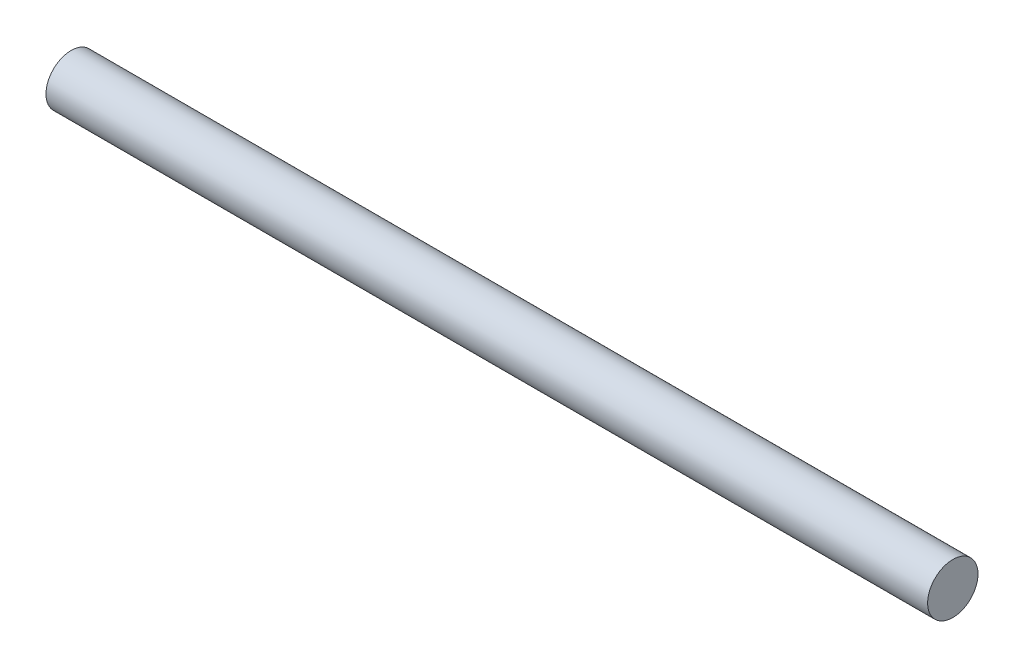
ISO-10303-21;
HEADER;
FILE_DESCRIPTION(('STEP AP214'),'2;1');
FILE_NAME('part.step','',(''),(''),'','','');
FILE_SCHEMA(('AUTOMOTIVE_DESIGN { 1 0 10303 214 1 1 1 1 }'));
ENDSEC;
DATA;
#1=APPLICATION_CONTEXT('core data for automotive mechanical design processes');
#2=APPLICATION_PROTOCOL_DEFINITION('international standard','automotive_design',2000,#1);
#3=PRODUCT_CONTEXT('',#1,'mechanical');
#4=PRODUCT('Part','Part','',(#3));
#5=PRODUCT_RELATED_PRODUCT_CATEGORY('part','',(#4));
#6=PRODUCT_DEFINITION_FORMATION('','',#4);
#7=PRODUCT_DEFINITION_CONTEXT('part definition',#1,'design');
#8=PRODUCT_DEFINITION('design','',#6,#7);
#9=PRODUCT_DEFINITION_SHAPE('','',#8);
#10=(LENGTH_UNIT() NAMED_UNIT(*) SI_UNIT(.MILLI.,.METRE.));
#11=(NAMED_UNIT(*) PLANE_ANGLE_UNIT() SI_UNIT($,.RADIAN.));
#12=(NAMED_UNIT(*) SI_UNIT($,.STERADIAN.) SOLID_ANGLE_UNIT());
#13=UNCERTAINTY_MEASURE_WITH_UNIT(LENGTH_MEASURE(1.E-05),#10,'distance_accuracy_value','');
#14=(GEOMETRIC_REPRESENTATION_CONTEXT(3) GLOBAL_UNCERTAINTY_ASSIGNED_CONTEXT((#13)) GLOBAL_UNIT_ASSIGNED_CONTEXT((#10,
#11,#12)) REPRESENTATION_CONTEXT('',''));
#15=CARTESIAN_POINT('',(0.,0.,0.));
#16=DIRECTION('',(0.,0.,1.));
#17=DIRECTION('',(1.,0.,0.));
#18=AXIS2_PLACEMENT_3D('',#15,#16,#17);
#19=CARTESIAN_POINT('',(0.,0.,0.));
#20=DIRECTION('',(-1.,0.,0.));
#21=DIRECTION('',(0.,0.,1.));
#22=AXIS2_PLACEMENT_3D('',#19,#20,#21);
#23=PLANE('',#22);
#24=CARTESIAN_POINT('',(0.,0.,0.));
#25=DIRECTION('',(1.,0.,0.));
#26=DIRECTION('',(0.,0.,-1.));
#27=AXIS2_PLACEMENT_3D('',#24,#25,#26);
#28=CIRCLE('',#27,2.);
#29=CARTESIAN_POINT('',(0.,0.,-2.));
#30=VERTEX_POINT('',#29);
#31=EDGE_CURVE('E10',#30,#30,#28,.T.);
#32=ORIENTED_EDGE('',*,*,#31,.F.);
#33=EDGE_LOOP('',(#32));
#34=FACE_BOUND('',#33,.T.);
#35=ADVANCED_FACE('F30',(#34),#23,.T.);
#36=CARTESIAN_POINT('',(70.,0.,0.));
#37=DIRECTION('',(1.,0.,0.));
#38=DIRECTION('',(0.,0.,-1.));
#39=AXIS2_PLACEMENT_3D('',#36,#37,#38);
#40=CYLINDRICAL_SURFACE('',#39,2.);
#41=ORIENTED_EDGE('',*,*,#31,.T.);
#42=EDGE_LOOP('',(#41));
#43=FACE_BOUND('',#42,.T.);
#44=CARTESIAN_POINT('',(70.,0.,0.));
#45=DIRECTION('',(1.,0.,0.));
#46=DIRECTION('',(0.,0.,-1.));
#47=AXIS2_PLACEMENT_3D('',#44,#45,#46);
#48=CIRCLE('',#47,2.);
#49=CARTESIAN_POINT('',(70.,0.,-2.));
#50=VERTEX_POINT('',#49);
#51=EDGE_CURVE('E36',#50,#50,#48,.T.);
#52=ORIENTED_EDGE('',*,*,#51,.F.);
#53=EDGE_LOOP('',(#52));
#54=FACE_BOUND('',#53,.T.);
#55=ADVANCED_FACE('F44',(#43,#54),#40,.T.);
#56=CARTESIAN_POINT('',(70.,0.,0.));
#57=DIRECTION('',(1.,0.,0.));
#58=DIRECTION('',(0.,0.,-1.));
#59=AXIS2_PLACEMENT_3D('',#56,#57,#58);
#60=PLANE('',#59);
#61=ORIENTED_EDGE('',*,*,#51,.T.);
#62=EDGE_LOOP('',(#61));
#63=FACE_BOUND('',#62,.T.);
#64=ADVANCED_FACE('F42',(#63),#60,.T.);
#65=CLOSED_SHELL('',(#35,#55,#64));
#66=MANIFOLD_SOLID_BREP('B2',#65);
#67=ADVANCED_BREP_SHAPE_REPRESENTATION('',(#18,#66),#14);
#68=SHAPE_DEFINITION_REPRESENTATION(#9,#67);
ENDSEC;
END-ISO-10303-21;
